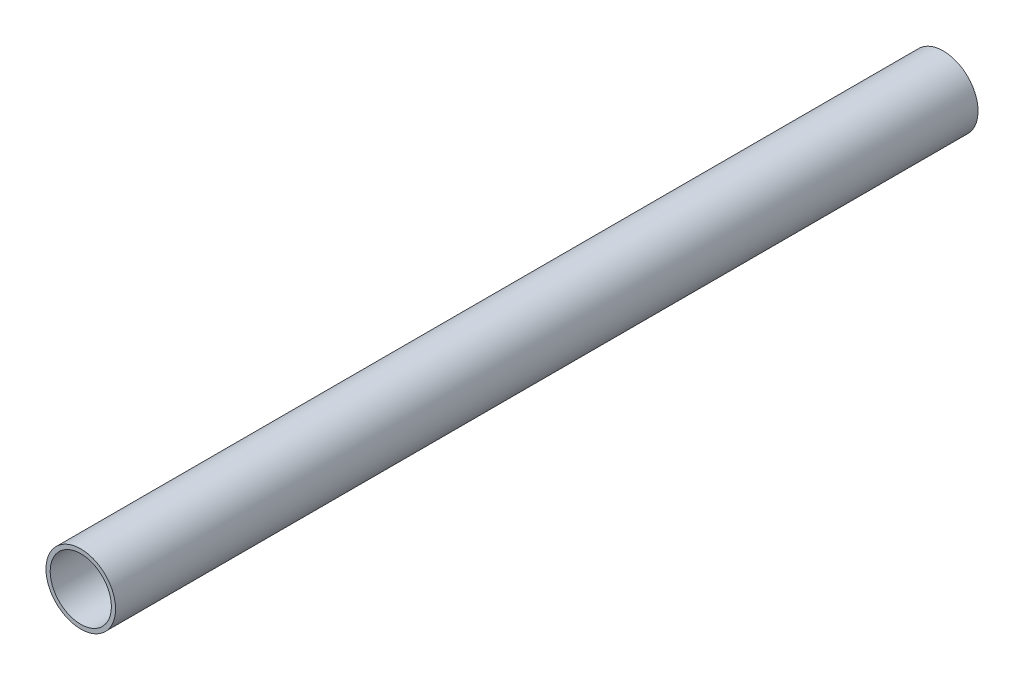
ISO-10303-21;
HEADER;
FILE_DESCRIPTION(('STEP AP214'),'2;1');
FILE_NAME('part.step','',(''),(''),'','','');
FILE_SCHEMA(('AUTOMOTIVE_DESIGN { 1 0 10303 214 1 1 1 1 }'));
ENDSEC;
DATA;
#1=APPLICATION_CONTEXT('core data for automotive mechanical design processes');
#2=APPLICATION_PROTOCOL_DEFINITION('international standard','automotive_design',2000,#1);
#3=PRODUCT_CONTEXT('',#1,'mechanical');
#4=PRODUCT('Part','Part','',(#3));
#5=PRODUCT_RELATED_PRODUCT_CATEGORY('part','',(#4));
#6=PRODUCT_DEFINITION_FORMATION('','',#4);
#7=PRODUCT_DEFINITION_CONTEXT('part definition',#1,'design');
#8=PRODUCT_DEFINITION('design','',#6,#7);
#9=PRODUCT_DEFINITION_SHAPE('','',#8);
#10=(LENGTH_UNIT() NAMED_UNIT(*) SI_UNIT(.MILLI.,.METRE.));
#11=(NAMED_UNIT(*) PLANE_ANGLE_UNIT() SI_UNIT($,.RADIAN.));
#12=(NAMED_UNIT(*) SI_UNIT($,.STERADIAN.) SOLID_ANGLE_UNIT());
#13=UNCERTAINTY_MEASURE_WITH_UNIT(LENGTH_MEASURE(1.E-05),#10,'distance_accuracy_value','');
#14=(GEOMETRIC_REPRESENTATION_CONTEXT(3) GLOBAL_UNCERTAINTY_ASSIGNED_CONTEXT((#13)) GLOBAL_UNIT_ASSIGNED_CONTEXT((#10,
#11,#12)) REPRESENTATION_CONTEXT('',''));
#15=CARTESIAN_POINT('',(0.,0.,0.));
#16=DIRECTION('',(0.,0.,1.));
#17=DIRECTION('',(1.,0.,0.));
#18=AXIS2_PLACEMENT_3D('',#15,#16,#17);
#19=CARTESIAN_POINT('',(0.,0.,500.));
#20=DIRECTION('',(0.,0.,-1.));
#21=DIRECTION('',(-1.,0.,0.));
#22=AXIS2_PLACEMENT_3D('',#19,#20,#21);
#23=CYLINDRICAL_SURFACE('',#22,12.5);
#24=CARTESIAN_POINT('',(0.,0.,500.));
#25=DIRECTION('',(0.,0.,1.));
#26=DIRECTION('',(1.,0.,0.));
#27=AXIS2_PLACEMENT_3D('',#24,#25,#26);
#28=CIRCLE('',#27,12.5);
#29=CARTESIAN_POINT('',(12.5,0.,500.));
#30=VERTEX_POINT('',#29);
#31=EDGE_CURVE('E10',#30,#30,#28,.T.);
#32=ORIENTED_EDGE('',*,*,#31,.F.);
#33=EDGE_LOOP('',(#32));
#34=FACE_BOUND('',#33,.T.);
#35=CARTESIAN_POINT('',(0.,0.,190.));
#36=DIRECTION('',(0.,0.,-1.));
#37=DIRECTION('',(-1.,0.,0.));
#38=AXIS2_PLACEMENT_3D('',#35,#36,#37);
#39=CIRCLE('',#38,12.5);
#40=CARTESIAN_POINT('',(-12.5,0.,190.));
#41=VERTEX_POINT('',#40);
#42=EDGE_CURVE('E55',#41,#41,#39,.T.);
#43=ORIENTED_EDGE('',*,*,#42,.F.);
#44=EDGE_LOOP('',(#43));
#45=FACE_BOUND('',#44,.T.);
#46=ADVANCED_FACE('F43',(#34,#45),#23,.T.);
#47=CARTESIAN_POINT('',(0.,0.,500.));
#48=DIRECTION('',(0.,0.,-1.));
#49=DIRECTION('',(-1.,0.,0.));
#50=AXIS2_PLACEMENT_3D('',#47,#48,#49);
#51=CYLINDRICAL_SURFACE('',#50,11.);
#52=CARTESIAN_POINT('',(0.,0.,500.));
#53=DIRECTION('',(0.,0.,1.));
#54=DIRECTION('',(1.,0.,0.));
#55=AXIS2_PLACEMENT_3D('',#52,#53,#54);
#56=CIRCLE('',#55,11.);
#57=CARTESIAN_POINT('',(11.,0.,500.));
#58=VERTEX_POINT('',#57);
#59=EDGE_CURVE('E50',#58,#58,#56,.T.);
#60=ORIENTED_EDGE('',*,*,#59,.T.);
#61=EDGE_LOOP('',(#60));
#62=FACE_BOUND('',#61,.T.);
#63=CARTESIAN_POINT('',(0.,0.,190.));
#64=DIRECTION('',(0.,0.,-1.));
#65=DIRECTION('',(-1.,0.,0.));
#66=AXIS2_PLACEMENT_3D('',#63,#64,#65);
#67=CIRCLE('',#66,11.);
#68=CARTESIAN_POINT('',(-11.,0.,190.));
#69=VERTEX_POINT('',#68);
#70=EDGE_CURVE('E60',#69,#69,#67,.T.);
#71=ORIENTED_EDGE('',*,*,#70,.T.);
#72=EDGE_LOOP('',(#71));
#73=FACE_BOUND('',#72,.T.);
#74=ADVANCED_FACE('F67',(#62,#73),#51,.F.);
#75=CARTESIAN_POINT('',(0.,0.,500.));
#76=DIRECTION('',(0.,0.,1.));
#77=DIRECTION('',(1.,0.,0.));
#78=AXIS2_PLACEMENT_3D('',#75,#76,#77);
#79=PLANE('',#78);
#80=ORIENTED_EDGE('',*,*,#31,.T.);
#81=EDGE_LOOP('',(#80));
#82=FACE_BOUND('',#81,.T.);
#83=ORIENTED_EDGE('',*,*,#59,.F.);
#84=EDGE_LOOP('',(#83));
#85=FACE_BOUND('',#84,.T.);
#86=ADVANCED_FACE('F72',(#82,#85),#79,.T.);
#87=CARTESIAN_POINT('',(0.,0.,190.));
#88=DIRECTION('',(0.,0.,-1.));
#89=DIRECTION('',(-1.,0.,0.));
#90=AXIS2_PLACEMENT_3D('',#87,#88,#89);
#91=PLANE('',#90);
#92=ORIENTED_EDGE('',*,*,#70,.F.);
#93=EDGE_LOOP('',(#92));
#94=FACE_BOUND('',#93,.T.);
#95=ORIENTED_EDGE('',*,*,#42,.T.);
#96=EDGE_LOOP('',(#95));
#97=FACE_BOUND('',#96,.T.);
#98=ADVANCED_FACE('F69',(#94,#97),#91,.T.);
#99=CLOSED_SHELL('',(#46,#74,#86,#98));
#100=MANIFOLD_SOLID_BREP('B2',#99);
#101=ADVANCED_BREP_SHAPE_REPRESENTATION('',(#18,#100),#14);
#102=SHAPE_DEFINITION_REPRESENTATION(#9,#101);
ENDSEC;
END-ISO-10303-21;
